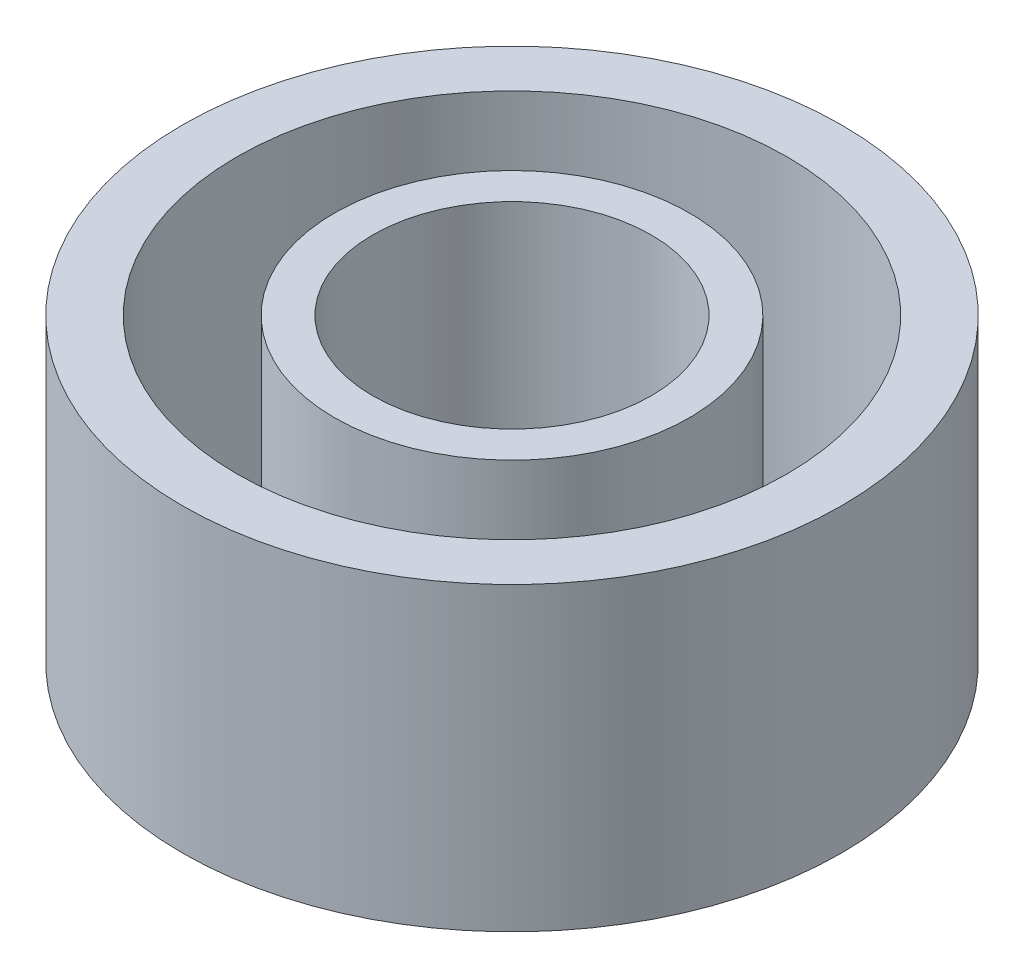
ISO-10303-21;
HEADER;
FILE_DESCRIPTION(('STEP AP214'),'2;1');
FILE_NAME('part.step','',(''),(''),'','','');
FILE_SCHEMA(('AUTOMOTIVE_DESIGN { 1 0 10303 214 1 1 1 1 }'));
ENDSEC;
DATA;
#1=APPLICATION_CONTEXT('core data for automotive mechanical design processes');
#2=APPLICATION_PROTOCOL_DEFINITION('international standard','automotive_design',2000,#1);
#3=PRODUCT_CONTEXT('',#1,'mechanical');
#4=PRODUCT('Part','Part','',(#3));
#5=PRODUCT_RELATED_PRODUCT_CATEGORY('part','',(#4));
#6=PRODUCT_DEFINITION_FORMATION('','',#4);
#7=PRODUCT_DEFINITION_CONTEXT('part definition',#1,'design');
#8=PRODUCT_DEFINITION('design','',#6,#7);
#9=PRODUCT_DEFINITION_SHAPE('','',#8);
#10=(LENGTH_UNIT() NAMED_UNIT(*) SI_UNIT(.MILLI.,.METRE.));
#11=(NAMED_UNIT(*) PLANE_ANGLE_UNIT() SI_UNIT($,.RADIAN.));
#12=(NAMED_UNIT(*) SI_UNIT($,.STERADIAN.) SOLID_ANGLE_UNIT());
#13=UNCERTAINTY_MEASURE_WITH_UNIT(LENGTH_MEASURE(1.E-05),#10,'distance_accuracy_value','');
#14=(GEOMETRIC_REPRESENTATION_CONTEXT(3) GLOBAL_UNCERTAINTY_ASSIGNED_CONTEXT((#13)) GLOBAL_UNIT_ASSIGNED_CONTEXT((#10,
#11,#12)) REPRESENTATION_CONTEXT('',''));
#15=CARTESIAN_POINT('',(0.,0.,0.));
#16=DIRECTION('',(0.,0.,1.));
#17=DIRECTION('',(1.,0.,0.));
#18=AXIS2_PLACEMENT_3D('',#15,#16,#17);
#19=CARTESIAN_POINT('',(0.,5.0165,0.));
#20=DIRECTION('',(0.,-1.,0.));
#21=DIRECTION('',(0.,0.,-1.));
#22=AXIS2_PLACEMENT_3D('',#19,#20,#21);
#23=CYLINDRICAL_SURFACE('',#22,2.3241);
#24=CARTESIAN_POINT('',(0.,5.0165,0.));
#25=DIRECTION('',(0.,1.,0.));
#26=DIRECTION('',(0.,0.,1.));
#27=AXIS2_PLACEMENT_3D('',#24,#25,#26);
#28=CIRCLE('',#27,2.3241);
#29=CARTESIAN_POINT('',(0.,5.0165,2.3241));
#30=VERTEX_POINT('',#29);
#31=EDGE_CURVE('E60',#30,#30,#28,.T.);
#32=ORIENTED_EDGE('',*,*,#31,.T.);
#33=EDGE_LOOP('',(#32));
#34=FACE_BOUND('',#33,.T.);
#35=CARTESIAN_POINT('',(0.,0.,0.));
#36=DIRECTION('',(0.,1.,0.));
#37=DIRECTION('',(0.,0.,1.));
#38=AXIS2_PLACEMENT_3D('',#35,#36,#37);
#39=CIRCLE('',#38,2.3241);
#40=CARTESIAN_POINT('',(0.,0.,2.3241));
#41=VERTEX_POINT('',#40);
#42=EDGE_CURVE('E66',#41,#41,#39,.T.);
#43=ORIENTED_EDGE('',*,*,#42,.F.);
#44=EDGE_LOOP('',(#43));
#45=FACE_BOUND('',#44,.T.);
#46=ADVANCED_FACE('F53',(#34,#45),#23,.F.);
#47=CARTESIAN_POINT('',(0.,5.0165,0.));
#48=DIRECTION('',(0.,-1.,0.));
#49=DIRECTION('',(0.,0.,-1.));
#50=AXIS2_PLACEMENT_3D('',#47,#48,#49);
#51=CYLINDRICAL_SURFACE('',#50,2.9591);
#52=CARTESIAN_POINT('',(0.,5.0165,0.));
#53=DIRECTION('',(0.,1.,0.));
#54=DIRECTION('',(0.,0.,1.));
#55=AXIS2_PLACEMENT_3D('',#52,#53,#54);
#56=CIRCLE('',#55,2.9591);
#57=CARTESIAN_POINT('',(0.,5.0165,2.9591));
#58=VERTEX_POINT('',#57);
#59=EDGE_CURVE('E12',#58,#58,#56,.T.);
#60=ORIENTED_EDGE('',*,*,#59,.F.);
#61=EDGE_LOOP('',(#60));
#62=FACE_BOUND('',#61,.T.);
#63=CARTESIAN_POINT('',(0.,0.,0.));
#64=DIRECTION('',(0.,1.,0.));
#65=DIRECTION('',(0.,0.,1.));
#66=AXIS2_PLACEMENT_3D('',#63,#64,#65);
#67=CIRCLE('',#66,2.9591);
#68=CARTESIAN_POINT('',(0.,0.,2.9591));
#69=VERTEX_POINT('',#68);
#70=EDGE_CURVE('E56',#69,#69,#67,.T.);
#71=ORIENTED_EDGE('',*,*,#70,.T.);
#72=EDGE_LOOP('',(#71));
#73=FACE_BOUND('',#72,.T.);
#74=ADVANCED_FACE('F73',(#62,#73),#51,.T.);
#75=CARTESIAN_POINT('',(0.,5.0165,0.));
#76=DIRECTION('',(0.,1.,0.));
#77=DIRECTION('',(0.,0.,1.));
#78=AXIS2_PLACEMENT_3D('',#75,#76,#77);
#79=PLANE('',#78);
#80=ORIENTED_EDGE('',*,*,#31,.F.);
#81=EDGE_LOOP('',(#80));
#82=FACE_BOUND('',#81,.T.);
#83=ORIENTED_EDGE('',*,*,#59,.T.);
#84=EDGE_LOOP('',(#83));
#85=FACE_BOUND('',#84,.T.);
#86=ADVANCED_FACE('F77',(#82,#85),#79,.T.);
#87=CARTESIAN_POINT('',(0.,0.,0.));
#88=DIRECTION('',(0.,1.,0.));
#89=DIRECTION('',(0.,0.,1.));
#90=AXIS2_PLACEMENT_3D('',#87,#88,#89);
#91=PLANE('',#90);
#92=ORIENTED_EDGE('',*,*,#42,.T.);
#93=EDGE_LOOP('',(#92));
#94=FACE_BOUND('',#93,.T.);
#95=ORIENTED_EDGE('',*,*,#70,.F.);
#96=EDGE_LOOP('',(#95));
#97=FACE_BOUND('',#96,.T.);
#98=ADVANCED_FACE('F75',(#94,#97),#91,.F.);
#99=CLOSED_SHELL('',(#46,#74,#86,#98));
#100=MANIFOLD_SOLID_BREP('B2',#99);
#101=CARTESIAN_POINT('',(0.,5.0165,0.));
#102=DIRECTION('',(0.,-1.,0.));
#103=DIRECTION('',(0.,0.,-1.));
#104=AXIS2_PLACEMENT_3D('',#101,#102,#103);
#105=CYLINDRICAL_SURFACE('',#104,4.5847);
#106=CARTESIAN_POINT('',(0.,5.0165,0.));
#107=DIRECTION('',(0.,1.,0.));
#108=DIRECTION('',(0.,0.,1.));
#109=AXIS2_PLACEMENT_3D('',#106,#107,#108);
#110=CIRCLE('',#109,4.5847);
#111=CARTESIAN_POINT('',(0.,5.0165,4.5847));
#112=VERTEX_POINT('',#111);
#113=EDGE_CURVE('E122',#112,#112,#110,.T.);
#114=ORIENTED_EDGE('',*,*,#113,.T.);
#115=EDGE_LOOP('',(#114));
#116=FACE_BOUND('',#115,.T.);
#117=CARTESIAN_POINT('',(0.,0.,0.));
#118=DIRECTION('',(0.,1.,0.));
#119=DIRECTION('',(0.,0.,1.));
#120=AXIS2_PLACEMENT_3D('',#117,#118,#119);
#121=CIRCLE('',#120,4.5847);
#122=CARTESIAN_POINT('',(0.,0.,4.5847));
#123=VERTEX_POINT('',#122);
#124=EDGE_CURVE('E128',#123,#123,#121,.T.);
#125=ORIENTED_EDGE('',*,*,#124,.F.);
#126=EDGE_LOOP('',(#125));
#127=FACE_BOUND('',#126,.T.);
#128=ADVANCED_FACE('F115',(#116,#127),#105,.F.);
#129=CARTESIAN_POINT('',(0.,5.0165,0.));
#130=DIRECTION('',(0.,-1.,0.));
#131=DIRECTION('',(0.,0.,-1.));
#132=AXIS2_PLACEMENT_3D('',#129,#130,#131);
#133=CYLINDRICAL_SURFACE('',#132,5.4991);
#134=CARTESIAN_POINT('',(0.,5.0165,0.));
#135=DIRECTION('',(0.,1.,0.));
#136=DIRECTION('',(0.,0.,1.));
#137=AXIS2_PLACEMENT_3D('',#134,#135,#136);
#138=CIRCLE('',#137,5.4991);
#139=CARTESIAN_POINT('',(0.,5.0165,5.4991));
#140=VERTEX_POINT('',#139);
#141=EDGE_CURVE('E52',#140,#140,#138,.T.);
#142=ORIENTED_EDGE('',*,*,#141,.F.);
#143=EDGE_LOOP('',(#142));
#144=FACE_BOUND('',#143,.T.);
#145=CARTESIAN_POINT('',(0.,0.,0.));
#146=DIRECTION('',(0.,1.,0.));
#147=DIRECTION('',(0.,0.,1.));
#148=AXIS2_PLACEMENT_3D('',#145,#146,#147);
#149=CIRCLE('',#148,5.4991);
#150=CARTESIAN_POINT('',(0.,0.,5.4991));
#151=VERTEX_POINT('',#150);
#152=EDGE_CURVE('E118',#151,#151,#149,.T.);
#153=ORIENTED_EDGE('',*,*,#152,.T.);
#154=EDGE_LOOP('',(#153));
#155=FACE_BOUND('',#154,.T.);
#156=ADVANCED_FACE('F135',(#144,#155),#133,.T.);
#157=CARTESIAN_POINT('',(0.,5.0165,0.));
#158=DIRECTION('',(0.,1.,0.));
#159=DIRECTION('',(0.,0.,1.));
#160=AXIS2_PLACEMENT_3D('',#157,#158,#159);
#161=PLANE('',#160);
#162=ORIENTED_EDGE('',*,*,#113,.F.);
#163=EDGE_LOOP('',(#162));
#164=FACE_BOUND('',#163,.T.);
#165=ORIENTED_EDGE('',*,*,#141,.T.);
#166=EDGE_LOOP('',(#165));
#167=FACE_BOUND('',#166,.T.);
#168=ADVANCED_FACE('F139',(#164,#167),#161,.T.);
#169=CARTESIAN_POINT('',(0.,0.,0.));
#170=DIRECTION('',(0.,1.,0.));
#171=DIRECTION('',(0.,0.,1.));
#172=AXIS2_PLACEMENT_3D('',#169,#170,#171);
#173=PLANE('',#172);
#174=ORIENTED_EDGE('',*,*,#124,.T.);
#175=EDGE_LOOP('',(#174));
#176=FACE_BOUND('',#175,.T.);
#177=ORIENTED_EDGE('',*,*,#152,.F.);
#178=EDGE_LOOP('',(#177));
#179=FACE_BOUND('',#178,.T.);
#180=ADVANCED_FACE('F137',(#176,#179),#173,.F.);
#181=CLOSED_SHELL('',(#128,#156,#168,#180));
#182=MANIFOLD_SOLID_BREP('B7',#181);
#183=ADVANCED_BREP_SHAPE_REPRESENTATION('',(#18,#100,#182),#14);
#184=SHAPE_DEFINITION_REPRESENTATION(#9,#183);
ENDSEC;
END-ISO-10303-21;
